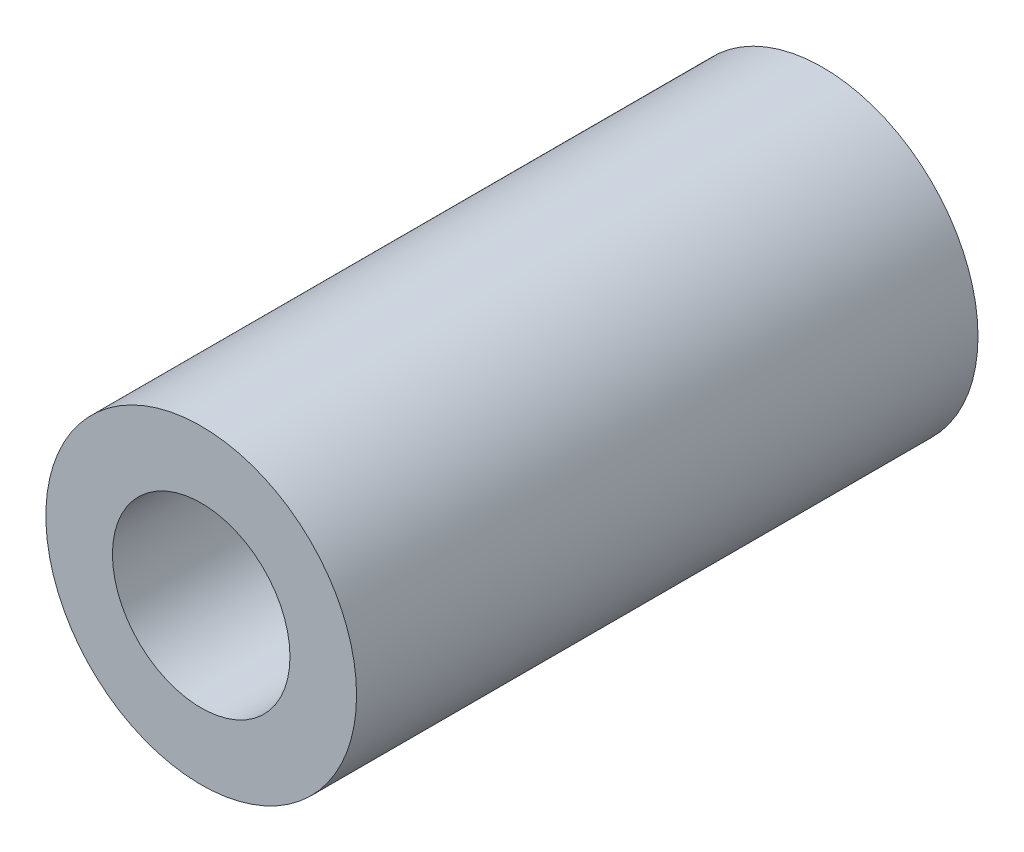
ISO-10303-21;
HEADER;
FILE_DESCRIPTION(('STEP AP214'),'2;1');
FILE_NAME('part.step','',(''),(''),'','','');
FILE_SCHEMA(('AUTOMOTIVE_DESIGN { 1 0 10303 214 1 1 1 1 }'));
ENDSEC;
DATA;
#1=APPLICATION_CONTEXT('core data for automotive mechanical design processes');
#2=APPLICATION_PROTOCOL_DEFINITION('international standard','automotive_design',2000,#1);
#3=PRODUCT_CONTEXT('',#1,'mechanical');
#4=PRODUCT('Part','Part','',(#3));
#5=PRODUCT_RELATED_PRODUCT_CATEGORY('part','',(#4));
#6=PRODUCT_DEFINITION_FORMATION('','',#4);
#7=PRODUCT_DEFINITION_CONTEXT('part definition',#1,'design');
#8=PRODUCT_DEFINITION('design','',#6,#7);
#9=PRODUCT_DEFINITION_SHAPE('','',#8);
#10=(LENGTH_UNIT() NAMED_UNIT(*) SI_UNIT(.MILLI.,.METRE.));
#11=(NAMED_UNIT(*) PLANE_ANGLE_UNIT() SI_UNIT($,.RADIAN.));
#12=(NAMED_UNIT(*) SI_UNIT($,.STERADIAN.) SOLID_ANGLE_UNIT());
#13=UNCERTAINTY_MEASURE_WITH_UNIT(LENGTH_MEASURE(1.E-05),#10,'distance_accuracy_value','');
#14=(GEOMETRIC_REPRESENTATION_CONTEXT(3) GLOBAL_UNCERTAINTY_ASSIGNED_CONTEXT((#13)) GLOBAL_UNIT_ASSIGNED_CONTEXT((#10,
#11,#12)) REPRESENTATION_CONTEXT('',''));
#15=CARTESIAN_POINT('',(0.,0.,0.));
#16=DIRECTION('',(0.,0.,1.));
#17=DIRECTION('',(1.,0.,0.));
#18=AXIS2_PLACEMENT_3D('',#15,#16,#17);
#19=CARTESIAN_POINT('',(0.,0.,14.));
#20=DIRECTION('',(0.,0.,1.));
#21=DIRECTION('',(1.,0.,0.));
#22=AXIS2_PLACEMENT_3D('',#19,#20,#21);
#23=PLANE('',#22);
#24=CARTESIAN_POINT('',(0.,0.,14.));
#25=DIRECTION('',(0.,0.,1.));
#26=DIRECTION('',(1.,0.,0.));
#27=AXIS2_PLACEMENT_3D('',#24,#25,#26);
#28=CIRCLE('',#27,3.5);
#29=CARTESIAN_POINT('',(3.5,0.,14.));
#30=VERTEX_POINT('',#29);
#31=EDGE_CURVE('E10',#30,#30,#28,.T.);
#32=ORIENTED_EDGE('',*,*,#31,.T.);
#33=EDGE_LOOP('',(#32));
#34=FACE_BOUND('',#33,.T.);
#35=CARTESIAN_POINT('',(0.,0.,14.));
#36=DIRECTION('',(0.,0.,1.));
#37=DIRECTION('',(1.,0.,0.));
#38=AXIS2_PLACEMENT_3D('',#35,#36,#37);
#39=CIRCLE('',#38,2.);
#40=CARTESIAN_POINT('',(2.,0.,14.));
#41=VERTEX_POINT('',#40);
#42=EDGE_CURVE('E42',#41,#41,#39,.T.);
#43=ORIENTED_EDGE('',*,*,#42,.F.);
#44=EDGE_LOOP('',(#43));
#45=FACE_BOUND('',#44,.T.);
#46=ADVANCED_FACE('F31',(#34,#45),#23,.T.);
#47=CARTESIAN_POINT('',(0.,0.,0.));
#48=DIRECTION('',(0.,0.,1.));
#49=DIRECTION('',(1.,0.,0.));
#50=AXIS2_PLACEMENT_3D('',#47,#48,#49);
#51=PLANE('',#50);
#52=CARTESIAN_POINT('',(0.,0.,0.));
#53=DIRECTION('',(0.,0.,1.));
#54=DIRECTION('',(1.,0.,0.));
#55=AXIS2_PLACEMENT_3D('',#52,#53,#54);
#56=CIRCLE('',#55,3.5);
#57=CARTESIAN_POINT('',(3.5,0.,0.));
#58=VERTEX_POINT('',#57);
#59=EDGE_CURVE('E35',#58,#58,#56,.T.);
#60=ORIENTED_EDGE('',*,*,#59,.F.);
#61=EDGE_LOOP('',(#60));
#62=FACE_BOUND('',#61,.T.);
#63=CARTESIAN_POINT('',(0.,0.,0.));
#64=DIRECTION('',(0.,0.,1.));
#65=DIRECTION('',(1.,0.,0.));
#66=AXIS2_PLACEMENT_3D('',#63,#64,#65);
#67=CIRCLE('',#66,2.);
#68=CARTESIAN_POINT('',(2.,0.,0.));
#69=VERTEX_POINT('',#68);
#70=EDGE_CURVE('E44',#69,#69,#67,.T.);
#71=ORIENTED_EDGE('',*,*,#70,.T.);
#72=EDGE_LOOP('',(#71));
#73=FACE_BOUND('',#72,.T.);
#74=ADVANCED_FACE('F54',(#62,#73),#51,.F.);
#75=CARTESIAN_POINT('',(0.,0.,14.));
#76=DIRECTION('',(0.,0.,-1.));
#77=DIRECTION('',(-1.,0.,0.));
#78=AXIS2_PLACEMENT_3D('',#75,#76,#77);
#79=CYLINDRICAL_SURFACE('',#78,3.5);
#80=ORIENTED_EDGE('',*,*,#31,.F.);
#81=EDGE_LOOP('',(#80));
#82=FACE_BOUND('',#81,.T.);
#83=ORIENTED_EDGE('',*,*,#59,.T.);
#84=EDGE_LOOP('',(#83));
#85=FACE_BOUND('',#84,.T.);
#86=ADVANCED_FACE('F33',(#82,#85),#79,.T.);
#87=CARTESIAN_POINT('',(0.,0.,14.));
#88=DIRECTION('',(0.,0.,-1.));
#89=DIRECTION('',(-1.,0.,0.));
#90=AXIS2_PLACEMENT_3D('',#87,#88,#89);
#91=CYLINDRICAL_SURFACE('',#90,2.);
#92=ORIENTED_EDGE('',*,*,#42,.T.);
#93=EDGE_LOOP('',(#92));
#94=FACE_BOUND('',#93,.T.);
#95=ORIENTED_EDGE('',*,*,#70,.F.);
#96=EDGE_LOOP('',(#95));
#97=FACE_BOUND('',#96,.T.);
#98=ADVANCED_FACE('F50',(#94,#97),#91,.F.);
#99=CLOSED_SHELL('',(#46,#74,#86,#98));
#100=MANIFOLD_SOLID_BREP('B2',#99);
#101=ADVANCED_BREP_SHAPE_REPRESENTATION('',(#18,#100),#14);
#102=SHAPE_DEFINITION_REPRESENTATION(#9,#101);
ENDSEC;
END-ISO-10303-21;
